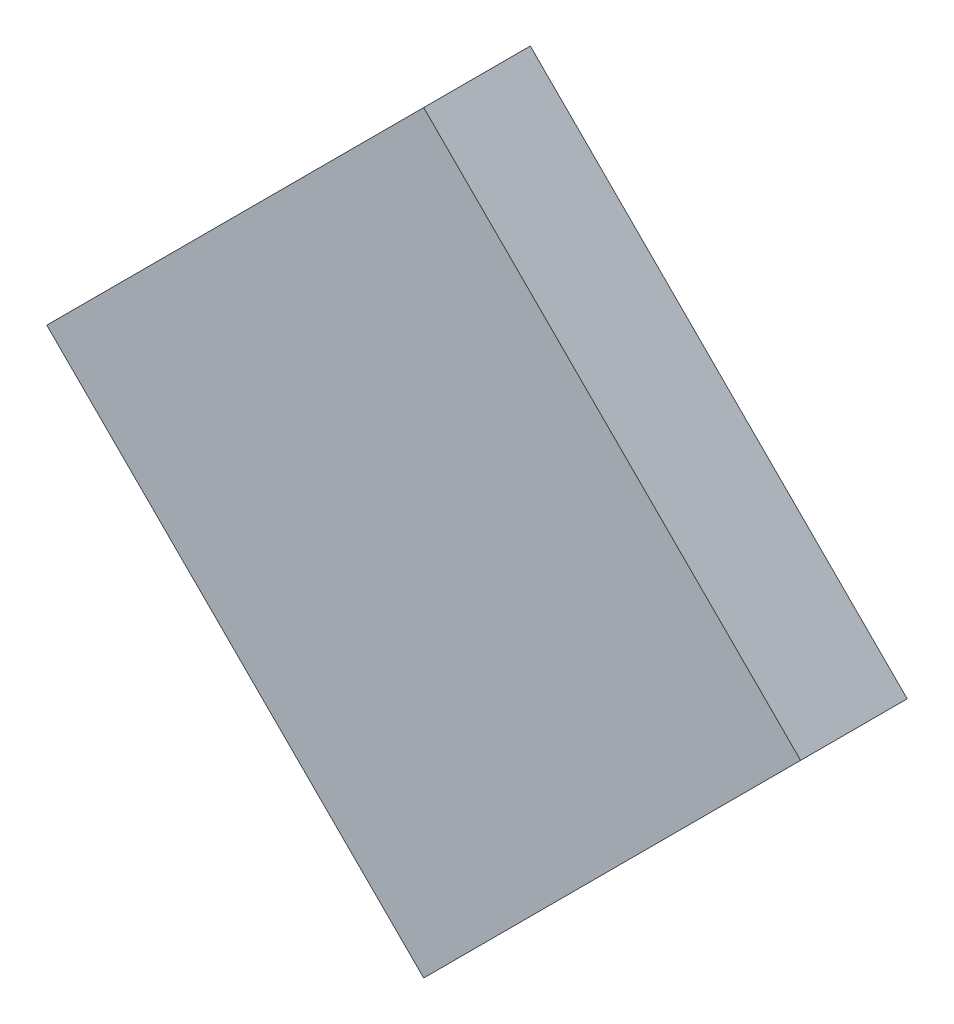
ISO-10303-21;
HEADER;
FILE_DESCRIPTION(('STEP AP214'),'2;1');
FILE_NAME('part.step','',(''),(''),'','','');
FILE_SCHEMA(('AUTOMOTIVE_DESIGN { 1 0 10303 214 1 1 1 1 }'));
ENDSEC;
DATA;
#1=APPLICATION_CONTEXT('core data for automotive mechanical design processes');
#2=APPLICATION_PROTOCOL_DEFINITION('international standard','automotive_design',2000,#1);
#3=PRODUCT_CONTEXT('',#1,'mechanical');
#4=PRODUCT('Part','Part','',(#3));
#5=PRODUCT_RELATED_PRODUCT_CATEGORY('part','',(#4));
#6=PRODUCT_DEFINITION_FORMATION('','',#4);
#7=PRODUCT_DEFINITION_CONTEXT('part definition',#1,'design');
#8=PRODUCT_DEFINITION('design','',#6,#7);
#9=PRODUCT_DEFINITION_SHAPE('','',#8);
#10=(LENGTH_UNIT() NAMED_UNIT(*) SI_UNIT(.MILLI.,.METRE.));
#11=(NAMED_UNIT(*) PLANE_ANGLE_UNIT() SI_UNIT($,.RADIAN.));
#12=(NAMED_UNIT(*) SI_UNIT($,.STERADIAN.) SOLID_ANGLE_UNIT());
#13=UNCERTAINTY_MEASURE_WITH_UNIT(LENGTH_MEASURE(1.E-05),#10,'distance_accuracy_value','');
#14=(GEOMETRIC_REPRESENTATION_CONTEXT(3) GLOBAL_UNCERTAINTY_ASSIGNED_CONTEXT((#13)) GLOBAL_UNIT_ASSIGNED_CONTEXT((#10,
#11,#12)) REPRESENTATION_CONTEXT('',''));
#15=CARTESIAN_POINT('',(0.,0.,0.));
#16=DIRECTION('',(0.,0.,1.));
#17=DIRECTION('',(1.,0.,0.));
#18=AXIS2_PLACEMENT_3D('',#15,#16,#17);
#19=CARTESIAN_POINT('',(-42.4264068711929,0.,12.));
#20=DIRECTION('',(0.707106781186548,-0.707106781186547,0.));
#21=DIRECTION('',(0.707106781186547,0.707106781186548,0.));
#22=AXIS2_PLACEMENT_3D('',#19,#20,#21);
#23=PLANE('',#22);
#24=DIRECTION('',(-0.707106781186547,-0.707106781186548,0.));
#25=VECTOR('',#24,1.);
#26=CARTESIAN_POINT('',(-42.4264068711929,0.,0.));
#27=LINE('',#26,#25);
#28=CARTESIAN_POINT('',(0.,42.4264068711929,0.));
#29=VERTEX_POINT('',#28);
#30=CARTESIAN_POINT('',(-42.4264068711929,0.,0.));
#31=VERTEX_POINT('',#30);
#32=EDGE_CURVE('E97',#29,#31,#27,.T.);
#33=ORIENTED_EDGE('',*,*,#32,.T.);
#34=DIRECTION('',(0.,0.,-1.));
#35=VECTOR('',#34,1.);
#36=CARTESIAN_POINT('',(-42.4264068711929,0.,12.));
#37=LINE('',#36,#35);
#38=CARTESIAN_POINT('',(-42.4264068711929,0.,12.));
#39=VERTEX_POINT('',#38);
#40=EDGE_CURVE('E11',#39,#31,#37,.T.);
#41=ORIENTED_EDGE('',*,*,#40,.F.);
#42=DIRECTION('',(-0.707106781186547,-0.707106781186548,0.));
#43=VECTOR('',#42,1.);
#44=CARTESIAN_POINT('',(-42.4264068711929,0.,12.));
#45=LINE('',#44,#43);
#46=CARTESIAN_POINT('',(0.,42.4264068711929,12.));
#47=VERTEX_POINT('',#46);
#48=EDGE_CURVE('E85',#47,#39,#45,.T.);
#49=ORIENTED_EDGE('',*,*,#48,.F.);
#50=DIRECTION('',(0.,0.,-1.));
#51=VECTOR('',#50,1.);
#52=CARTESIAN_POINT('',(0.,42.4264068711929,12.));
#53=LINE('',#52,#51);
#54=EDGE_CURVE('E93',#47,#29,#53,.T.);
#55=ORIENTED_EDGE('',*,*,#54,.T.);
#56=EDGE_LOOP('',(#33,#41,#49,#55));
#57=FACE_BOUND('',#56,.T.);
#58=ADVANCED_FACE('F34',(#57),#23,.F.);
#59=CARTESIAN_POINT('',(-42.4264068711929,0.,12.));
#60=DIRECTION('',(0.707106781186547,0.707106781186548,0.));
#61=DIRECTION('',(-0.707106781186548,0.707106781186547,0.));
#62=AXIS2_PLACEMENT_3D('',#59,#60,#61);
#63=PLANE('',#62);
#64=DIRECTION('',(0.707106781186548,-0.707106781186547,0.));
#65=VECTOR('',#64,1.);
#66=CARTESIAN_POINT('',(-42.4264068711929,0.,0.));
#67=LINE('',#66,#65);
#68=CARTESIAN_POINT('',(0.,-42.4264068711928,0.));
#69=VERTEX_POINT('',#68);
#70=EDGE_CURVE('E89',#31,#69,#67,.T.);
#71=ORIENTED_EDGE('',*,*,#70,.T.);
#72=DIRECTION('',(0.,0.,-1.));
#73=VECTOR('',#72,1.);
#74=CARTESIAN_POINT('',(0.,-42.4264068711928,12.));
#75=LINE('',#74,#73);
#76=CARTESIAN_POINT('',(0.,-42.4264068711928,12.));
#77=VERTEX_POINT('',#76);
#78=EDGE_CURVE('E42',#77,#69,#75,.T.);
#79=ORIENTED_EDGE('',*,*,#78,.F.);
#80=DIRECTION('',(0.707106781186548,-0.707106781186547,0.));
#81=VECTOR('',#80,1.);
#82=CARTESIAN_POINT('',(-42.4264068711929,0.,12.));
#83=LINE('',#82,#81);
#84=EDGE_CURVE('E80',#39,#77,#83,.T.);
#85=ORIENTED_EDGE('',*,*,#84,.F.);
#86=ORIENTED_EDGE('',*,*,#40,.T.);
#87=EDGE_LOOP('',(#71,#79,#85,#86));
#88=FACE_BOUND('',#87,.T.);
#89=ADVANCED_FACE('F88',(#88),#63,.F.);
#90=CARTESIAN_POINT('',(0.,-42.4264068711928,12.));
#91=DIRECTION('',(-0.707106781186547,0.707106781186548,0.));
#92=DIRECTION('',(-0.707106781186548,-0.707106781186547,0.));
#93=AXIS2_PLACEMENT_3D('',#90,#91,#92);
#94=PLANE('',#93);
#95=DIRECTION('',(0.707106781186548,0.707106781186547,0.));
#96=VECTOR('',#95,1.);
#97=CARTESIAN_POINT('',(0.,-42.4264068711928,0.));
#98=LINE('',#97,#96);
#99=CARTESIAN_POINT('',(42.4264068711928,0.,0.));
#100=VERTEX_POINT('',#99);
#101=EDGE_CURVE('E67',#69,#100,#98,.T.);
#102=ORIENTED_EDGE('',*,*,#101,.T.);
#103=DIRECTION('',(0.,0.,-1.));
#104=VECTOR('',#103,1.);
#105=CARTESIAN_POINT('',(42.4264068711928,0.,12.));
#106=LINE('',#105,#104);
#107=CARTESIAN_POINT('',(42.4264068711928,0.,12.));
#108=VERTEX_POINT('',#107);
#109=EDGE_CURVE('E90',#108,#100,#106,.T.);
#110=ORIENTED_EDGE('',*,*,#109,.F.);
#111=DIRECTION('',(0.707106781186548,0.707106781186547,0.));
#112=VECTOR('',#111,1.);
#113=CARTESIAN_POINT('',(0.,-42.4264068711928,12.));
#114=LINE('',#113,#112);
#115=EDGE_CURVE('E83',#77,#108,#114,.T.);
#116=ORIENTED_EDGE('',*,*,#115,.F.);
#117=ORIENTED_EDGE('',*,*,#78,.T.);
#118=EDGE_LOOP('',(#102,#110,#116,#117));
#119=FACE_BOUND('',#118,.T.);
#120=ADVANCED_FACE('F91',(#119),#94,.F.);
#121=CARTESIAN_POINT('',(0.,42.4264068711929,12.));
#122=DIRECTION('',(-0.707106781186547,-0.707106781186548,0.));
#123=DIRECTION('',(0.707106781186548,-0.707106781186547,0.));
#124=AXIS2_PLACEMENT_3D('',#121,#122,#123);
#125=PLANE('',#124);
#126=DIRECTION('',(-0.707106781186548,0.707106781186547,0.));
#127=VECTOR('',#126,1.);
#128=CARTESIAN_POINT('',(0.,42.4264068711929,0.));
#129=LINE('',#128,#127);
#130=EDGE_CURVE('E73',#100,#29,#129,.T.);
#131=ORIENTED_EDGE('',*,*,#130,.T.);
#132=ORIENTED_EDGE('',*,*,#54,.F.);
#133=DIRECTION('',(-0.707106781186548,0.707106781186547,0.));
#134=VECTOR('',#133,1.);
#135=CARTESIAN_POINT('',(0.,42.4264068711929,12.));
#136=LINE('',#135,#134);
#137=EDGE_CURVE('E50',#108,#47,#136,.T.);
#138=ORIENTED_EDGE('',*,*,#137,.F.);
#139=ORIENTED_EDGE('',*,*,#109,.T.);
#140=EDGE_LOOP('',(#131,#132,#138,#139));
#141=FACE_BOUND('',#140,.T.);
#142=ADVANCED_FACE('F104',(#141),#125,.F.);
#143=CARTESIAN_POINT('',(0.,0.,12.));
#144=DIRECTION('',(0.,0.,-1.));
#145=DIRECTION('',(-1.,0.,0.));
#146=AXIS2_PLACEMENT_3D('',#143,#144,#145);
#147=PLANE('',#146);
#148=ORIENTED_EDGE('',*,*,#48,.T.);
#149=ORIENTED_EDGE('',*,*,#84,.T.);
#150=ORIENTED_EDGE('',*,*,#115,.T.);
#151=ORIENTED_EDGE('',*,*,#137,.T.);
#152=EDGE_LOOP('',(#148,#149,#150,#151));
#153=FACE_BOUND('',#152,.T.);
#154=ADVANCED_FACE('F81',(#153),#147,.F.);
#155=CARTESIAN_POINT('',(0.,0.,0.));
#156=DIRECTION('',(0.,0.,-1.));
#157=DIRECTION('',(-1.,0.,0.));
#158=AXIS2_PLACEMENT_3D('',#155,#156,#157);
#159=PLANE('',#158);
#160=ORIENTED_EDGE('',*,*,#32,.F.);
#161=ORIENTED_EDGE('',*,*,#130,.F.);
#162=ORIENTED_EDGE('',*,*,#101,.F.);
#163=ORIENTED_EDGE('',*,*,#70,.F.);
#164=EDGE_LOOP('',(#160,#161,#162,#163));
#165=FACE_BOUND('',#164,.T.);
#166=ADVANCED_FACE('F107',(#165),#159,.T.);
#167=CLOSED_SHELL('',(#58,#89,#120,#142,#154,#166));
#168=MANIFOLD_SOLID_BREP('B2',#167);
#169=ADVANCED_BREP_SHAPE_REPRESENTATION('',(#18,#168),#14);
#170=SHAPE_DEFINITION_REPRESENTATION(#9,#169);
ENDSEC;
END-ISO-10303-21;
